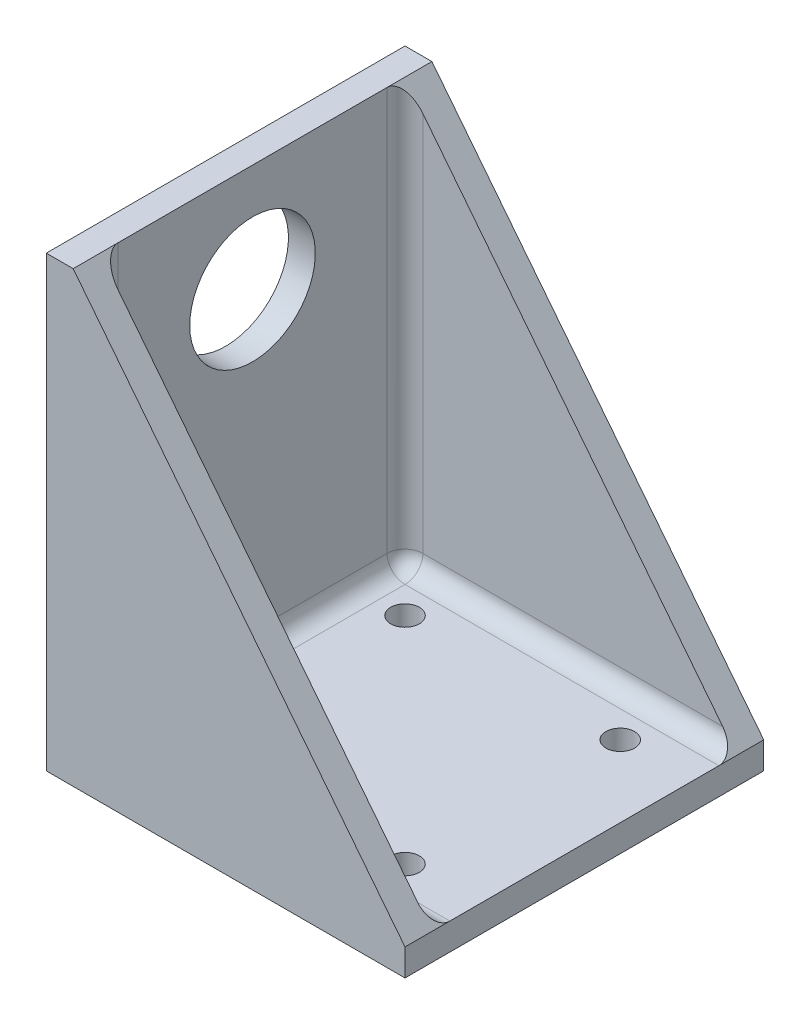
ISO-10303-21;
HEADER;
FILE_DESCRIPTION(('STEP AP214'),'2;1');
FILE_NAME('part.step','',(''),(''),'','','');
FILE_SCHEMA(('AUTOMOTIVE_DESIGN { 1 0 10303 214 1 1 1 1 }'));
ENDSEC;
DATA;
#1=APPLICATION_CONTEXT('core data for automotive mechanical design processes');
#2=APPLICATION_PROTOCOL_DEFINITION('international standard','automotive_design',2000,#1);
#3=PRODUCT_CONTEXT('',#1,'mechanical');
#4=PRODUCT('Part','Part','',(#3));
#5=PRODUCT_RELATED_PRODUCT_CATEGORY('part','',(#4));
#6=PRODUCT_DEFINITION_FORMATION('','',#4);
#7=PRODUCT_DEFINITION_CONTEXT('part definition',#1,'design');
#8=PRODUCT_DEFINITION('design','',#6,#7);
#9=PRODUCT_DEFINITION_SHAPE('','',#8);
#10=(LENGTH_UNIT() NAMED_UNIT(*) SI_UNIT(.MILLI.,.METRE.));
#11=(NAMED_UNIT(*) PLANE_ANGLE_UNIT() SI_UNIT($,.RADIAN.));
#12=(NAMED_UNIT(*) SI_UNIT($,.STERADIAN.) SOLID_ANGLE_UNIT());
#13=UNCERTAINTY_MEASURE_WITH_UNIT(LENGTH_MEASURE(1.E-05),#10,'distance_accuracy_value','');
#14=(GEOMETRIC_REPRESENTATION_CONTEXT(3) GLOBAL_UNCERTAINTY_ASSIGNED_CONTEXT((#13)) GLOBAL_UNIT_ASSIGNED_CONTEXT((#10,
#11,#12)) REPRESENTATION_CONTEXT('',''));
#15=CARTESIAN_POINT('',(0.,0.,0.));
#16=DIRECTION('',(0.,0.,1.));
#17=DIRECTION('',(1.,0.,0.));
#18=AXIS2_PLACEMENT_3D('',#15,#16,#17);
#19=CARTESIAN_POINT('',(0.,3.,0.));
#20=DIRECTION('',(0.,-1.,0.));
#21=DIRECTION('',(0.,0.,-1.));
#22=AXIS2_PLACEMENT_3D('',#19,#20,#21);
#23=PLANE('',#22);
#24=DIRECTION('',(0.,0.,1.));
#25=VECTOR('',#24,1.);
#26=CARTESIAN_POINT('',(-15.,3.,0.));
#27=LINE('',#26,#25);
#28=CARTESIAN_POINT('',(-15.,3.,-15.));
#29=VERTEX_POINT('',#28);
#30=CARTESIAN_POINT('',(-15.,3.,15.));
#31=VERTEX_POINT('',#30);
#32=EDGE_CURVE('E204',#29,#31,#27,.T.);
#33=ORIENTED_EDGE('',*,*,#32,.T.);
#34=DIRECTION('',(1.,0.,0.));
#35=VECTOR('',#34,1.);
#36=CARTESIAN_POINT('',(0.,3.,15.));
#37=LINE('',#36,#35);
#38=CARTESIAN_POINT('',(20.,3.,15.));
#39=VERTEX_POINT('',#38);
#40=EDGE_CURVE('E210',#31,#39,#37,.T.);
#41=ORIENTED_EDGE('',*,*,#40,.T.);
#42=DIRECTION('',(0.,0.,-1.));
#43=VECTOR('',#42,1.);
#44=CARTESIAN_POINT('',(20.,3.,20.));
#45=LINE('',#44,#43);
#46=CARTESIAN_POINT('',(20.,3.,-15.));
#47=VERTEX_POINT('',#46);
#48=EDGE_CURVE('E329',#39,#47,#45,.T.);
#49=ORIENTED_EDGE('',*,*,#48,.T.);
#50=DIRECTION('',(-1.,0.,0.));
#51=VECTOR('',#50,1.);
#52=CARTESIAN_POINT('',(0.,3.,-15.));
#53=LINE('',#52,#51);
#54=EDGE_CURVE('E207',#47,#29,#53,.T.);
#55=ORIENTED_EDGE('',*,*,#54,.T.);
#56=EDGE_LOOP('',(#33,#41,#49,#55));
#57=FACE_BOUND('',#56,.T.);
#58=CARTESIAN_POINT('',(-12.,3.,-12.));
#59=DIRECTION('',(0.,1.,0.));
#60=DIRECTION('',(0.,0.,1.));
#61=AXIS2_PLACEMENT_3D('',#58,#59,#60);
#62=CIRCLE('',#61,1.6);
#63=CARTESIAN_POINT('',(-12.,3.,-10.4));
#64=VERTEX_POINT('',#63);
#65=EDGE_CURVE('E319',#64,#64,#62,.T.);
#66=ORIENTED_EDGE('',*,*,#65,.F.);
#67=EDGE_LOOP('',(#66));
#68=FACE_BOUND('',#67,.T.);
#69=CARTESIAN_POINT('',(-12.,3.,12.));
#70=DIRECTION('',(0.,1.,0.));
#71=DIRECTION('',(0.,0.,-1.));
#72=AXIS2_PLACEMENT_3D('',#69,#70,#71);
#73=CIRCLE('',#72,1.6);
#74=CARTESIAN_POINT('',(-12.,3.,10.4));
#75=VERTEX_POINT('',#74);
#76=EDGE_CURVE('E311',#75,#75,#73,.T.);
#77=ORIENTED_EDGE('',*,*,#76,.F.);
#78=EDGE_LOOP('',(#77));
#79=FACE_BOUND('',#78,.T.);
#80=CARTESIAN_POINT('',(12.,3.,12.));
#81=DIRECTION('',(0.,1.,0.));
#82=DIRECTION('',(0.,0.,1.));
#83=AXIS2_PLACEMENT_3D('',#80,#81,#82);
#84=CIRCLE('',#83,1.6);
#85=CARTESIAN_POINT('',(12.,3.,13.6));
#86=VERTEX_POINT('',#85);
#87=EDGE_CURVE('E303',#86,#86,#84,.T.);
#88=ORIENTED_EDGE('',*,*,#87,.F.);
#89=EDGE_LOOP('',(#88));
#90=FACE_BOUND('',#89,.T.);
#91=CARTESIAN_POINT('',(12.,3.,-12.));
#92=DIRECTION('',(0.,1.,0.));
#93=DIRECTION('',(0.,0.,-1.));
#94=AXIS2_PLACEMENT_3D('',#91,#92,#93);
#95=CIRCLE('',#94,1.6);
#96=CARTESIAN_POINT('',(12.,3.,-13.6));
#97=VERTEX_POINT('',#96);
#98=EDGE_CURVE('E295',#97,#97,#95,.T.);
#99=ORIENTED_EDGE('',*,*,#98,.F.);
#100=EDGE_LOOP('',(#99));
#101=FACE_BOUND('',#100,.T.);
#102=ADVANCED_FACE('F45',(#57,#68,#79,#90,#101),#23,.F.);
#103=CARTESIAN_POINT('',(0.,0.,0.));
#104=DIRECTION('',(0.,-1.,0.));
#105=DIRECTION('',(0.,0.,-1.));
#106=AXIS2_PLACEMENT_3D('',#103,#104,#105);
#107=PLANE('',#106);
#108=DIRECTION('',(1.,0.,0.));
#109=VECTOR('',#108,1.);
#110=CARTESIAN_POINT('',(-20.,0.,20.));
#111=LINE('',#110,#109);
#112=CARTESIAN_POINT('',(-20.,0.,20.));
#113=VERTEX_POINT('',#112);
#114=CARTESIAN_POINT('',(20.,0.,20.));
#115=VERTEX_POINT('',#114);
#116=EDGE_CURVE('E338',#113,#115,#111,.T.);
#117=ORIENTED_EDGE('',*,*,#116,.F.);
#118=DIRECTION('',(0.,0.,1.));
#119=VECTOR('',#118,1.);
#120=CARTESIAN_POINT('',(-20.,0.,20.));
#121=LINE('',#120,#119);
#122=CARTESIAN_POINT('',(-20.,0.,-20.));
#123=VERTEX_POINT('',#122);
#124=EDGE_CURVE('E335',#123,#113,#121,.T.);
#125=ORIENTED_EDGE('',*,*,#124,.F.);
#126=DIRECTION('',(-1.,0.,0.));
#127=VECTOR('',#126,1.);
#128=CARTESIAN_POINT('',(-20.,0.,-20.));
#129=LINE('',#128,#127);
#130=CARTESIAN_POINT('',(20.,0.,-20.));
#131=VERTEX_POINT('',#130);
#132=EDGE_CURVE('E332',#131,#123,#129,.T.);
#133=ORIENTED_EDGE('',*,*,#132,.F.);
#134=DIRECTION('',(0.,0.,-1.));
#135=VECTOR('',#134,1.);
#136=CARTESIAN_POINT('',(20.,0.,20.));
#137=LINE('',#136,#135);
#138=EDGE_CURVE('E171',#115,#131,#137,.T.);
#139=ORIENTED_EDGE('',*,*,#138,.F.);
#140=EDGE_LOOP('',(#117,#125,#133,#139));
#141=FACE_BOUND('',#140,.T.);
#142=CARTESIAN_POINT('',(12.,0.,12.));
#143=DIRECTION('',(0.,1.,0.));
#144=DIRECTION('',(0.,0.,1.));
#145=AXIS2_PLACEMENT_3D('',#142,#143,#144);
#146=CIRCLE('',#145,1.6);
#147=CARTESIAN_POINT('',(12.,0.,13.6));
#148=VERTEX_POINT('',#147);
#149=EDGE_CURVE('E299',#148,#148,#146,.T.);
#150=ORIENTED_EDGE('',*,*,#149,.T.);
#151=EDGE_LOOP('',(#150));
#152=FACE_BOUND('',#151,.T.);
#153=CARTESIAN_POINT('',(-12.,0.,-12.));
#154=DIRECTION('',(0.,1.,0.));
#155=DIRECTION('',(0.,0.,1.));
#156=AXIS2_PLACEMENT_3D('',#153,#154,#155);
#157=CIRCLE('',#156,1.6);
#158=CARTESIAN_POINT('',(-12.,0.,-10.4));
#159=VERTEX_POINT('',#158);
#160=EDGE_CURVE('E315',#159,#159,#157,.T.);
#161=ORIENTED_EDGE('',*,*,#160,.T.);
#162=EDGE_LOOP('',(#161));
#163=FACE_BOUND('',#162,.T.);
#164=CARTESIAN_POINT('',(-12.,0.,12.));
#165=DIRECTION('',(0.,1.,0.));
#166=DIRECTION('',(0.,0.,-1.));
#167=AXIS2_PLACEMENT_3D('',#164,#165,#166);
#168=CIRCLE('',#167,1.6);
#169=CARTESIAN_POINT('',(-12.,0.,10.4));
#170=VERTEX_POINT('',#169);
#171=EDGE_CURVE('E307',#170,#170,#168,.T.);
#172=ORIENTED_EDGE('',*,*,#171,.T.);
#173=EDGE_LOOP('',(#172));
#174=FACE_BOUND('',#173,.T.);
#175=CARTESIAN_POINT('',(12.,0.,-12.));
#176=DIRECTION('',(0.,1.,0.));
#177=DIRECTION('',(0.,0.,-1.));
#178=AXIS2_PLACEMENT_3D('',#175,#176,#177);
#179=CIRCLE('',#178,1.6);
#180=CARTESIAN_POINT('',(12.,0.,-13.6));
#181=VERTEX_POINT('',#180);
#182=EDGE_CURVE('E291',#181,#181,#179,.T.);
#183=ORIENTED_EDGE('',*,*,#182,.T.);
#184=EDGE_LOOP('',(#183));
#185=FACE_BOUND('',#184,.T.);
#186=ADVANCED_FACE('F352',(#141,#152,#163,#174,#185),#107,.T.);
#187=CARTESIAN_POINT('',(20.,3.,20.));
#188=DIRECTION('',(-1.,0.,0.));
#189=DIRECTION('',(0.,0.,1.));
#190=AXIS2_PLACEMENT_3D('',#187,#188,#189);
#191=PLANE('',#190);
#192=ORIENTED_EDGE('',*,*,#138,.T.);
#193=DIRECTION('',(0.,-1.,0.));
#194=VECTOR('',#193,1.);
#195=CARTESIAN_POINT('',(20.,3.,-20.));
#196=LINE('',#195,#194);
#197=CARTESIAN_POINT('',(20.,3.,-20.));
#198=VERTEX_POINT('',#197);
#199=EDGE_CURVE('E161',#198,#131,#196,.T.);
#200=ORIENTED_EDGE('',*,*,#199,.F.);
#201=DIRECTION('',(0.,0.,-1.));
#202=VECTOR('',#201,1.);
#203=CARTESIAN_POINT('',(20.,3.,-17.));
#204=LINE('',#203,#202);
#205=EDGE_CURVE('E63',#47,#198,#204,.T.);
#206=ORIENTED_EDGE('',*,*,#205,.F.);
#207=ORIENTED_EDGE('',*,*,#48,.F.);
#208=CARTESIAN_POINT('',(20.,3.,20.));
#209=VERTEX_POINT('',#208);
#210=EDGE_CURVE('E86',#209,#39,#45,.T.);
#211=ORIENTED_EDGE('',*,*,#210,.F.);
#212=DIRECTION('',(0.,-1.,0.));
#213=VECTOR('',#212,1.);
#214=CARTESIAN_POINT('',(20.,3.,20.));
#215=LINE('',#214,#213);
#216=EDGE_CURVE('E328',#209,#115,#215,.T.);
#217=ORIENTED_EDGE('',*,*,#216,.T.);
#218=EDGE_LOOP('',(#192,#200,#206,#207,#211,#217));
#219=FACE_BOUND('',#218,.T.);
#220=ADVANCED_FACE('F168',(#219),#191,.F.);
#221=CARTESIAN_POINT('',(-20.,3.,-20.));
#222=DIRECTION('',(0.,0.,1.));
#223=DIRECTION('',(1.,0.,0.));
#224=AXIS2_PLACEMENT_3D('',#221,#222,#223);
#225=PLANE('',#224);
#226=ORIENTED_EDGE('',*,*,#132,.T.);
#227=DIRECTION('',(0.,-1.,0.));
#228=VECTOR('',#227,1.);
#229=CARTESIAN_POINT('',(-20.,3.,-20.));
#230=LINE('',#229,#228);
#231=CARTESIAN_POINT('',(-20.,50.,-20.));
#232=VERTEX_POINT('',#231);
#233=EDGE_CURVE('E175',#232,#123,#230,.T.);
#234=ORIENTED_EDGE('',*,*,#233,.F.);
#235=DIRECTION('',(-1.,0.,0.));
#236=VECTOR('',#235,1.);
#237=CARTESIAN_POINT('',(-17.,50.,-20.));
#238=LINE('',#237,#236);
#239=CARTESIAN_POINT('',(-17.,50.,-20.));
#240=VERTEX_POINT('',#239);
#241=EDGE_CURVE('E164',#240,#232,#238,.T.);
#242=ORIENTED_EDGE('',*,*,#241,.F.);
#243=DIRECTION('',(-0.618559606331261,0.785737878312682,0.));
#244=VECTOR('',#243,1.);
#245=CARTESIAN_POINT('',(-17.,50.,-20.));
#246=LINE('',#245,#244);
#247=EDGE_CURVE('E148',#198,#240,#246,.T.);
#248=ORIENTED_EDGE('',*,*,#247,.F.);
#249=ORIENTED_EDGE('',*,*,#199,.T.);
#250=EDGE_LOOP('',(#226,#234,#242,#248,#249));
#251=FACE_BOUND('',#250,.T.);
#252=ADVANCED_FACE('F160',(#251),#225,.F.);
#253=CARTESIAN_POINT('',(-20.,3.,20.));
#254=DIRECTION('',(1.,0.,0.));
#255=DIRECTION('',(0.,0.,-1.));
#256=AXIS2_PLACEMENT_3D('',#253,#254,#255);
#257=PLANE('',#256);
#258=DIRECTION('',(0.,0.,-1.));
#259=VECTOR('',#258,1.);
#260=CARTESIAN_POINT('',(-20.,50.,-20.));
#261=LINE('',#260,#259);
#262=CARTESIAN_POINT('',(-20.,50.,20.));
#263=VERTEX_POINT('',#262);
#264=EDGE_CURVE('E282',#263,#232,#261,.T.);
#265=ORIENTED_EDGE('',*,*,#264,.T.);
#266=ORIENTED_EDGE('',*,*,#233,.T.);
#267=ORIENTED_EDGE('',*,*,#124,.T.);
#268=DIRECTION('',(0.,-1.,0.));
#269=VECTOR('',#268,1.);
#270=CARTESIAN_POINT('',(-20.,3.,20.));
#271=LINE('',#270,#269);
#272=EDGE_CURVE('E182',#263,#113,#271,.T.);
#273=ORIENTED_EDGE('',*,*,#272,.F.);
#274=EDGE_LOOP('',(#265,#266,#267,#273));
#275=FACE_BOUND('',#274,.T.);
#276=CARTESIAN_POINT('',(-20.,38.,0.));
#277=DIRECTION('',(-1.,0.,0.));
#278=DIRECTION('',(0.,0.,1.));
#279=AXIS2_PLACEMENT_3D('',#276,#277,#278);
#280=CIRCLE('',#279,7.);
#281=CARTESIAN_POINT('',(-20.,38.,7.00000000000002));
#282=VERTEX_POINT('',#281);
#283=EDGE_CURVE('E269',#282,#282,#280,.T.);
#284=ORIENTED_EDGE('',*,*,#283,.F.);
#285=EDGE_LOOP('',(#284));
#286=FACE_BOUND('',#285,.T.);
#287=ADVANCED_FACE('F354',(#275,#286),#257,.F.);
#288=CARTESIAN_POINT('',(-20.,3.,20.));
#289=DIRECTION('',(0.,0.,-1.));
#290=DIRECTION('',(-1.,0.,0.));
#291=AXIS2_PLACEMENT_3D('',#288,#289,#290);
#292=PLANE('',#291);
#293=ORIENTED_EDGE('',*,*,#216,.F.);
#294=DIRECTION('',(-0.618559606331261,0.785737878312682,0.));
#295=VECTOR('',#294,1.);
#296=CARTESIAN_POINT('',(-17.,50.,20.));
#297=LINE('',#296,#295);
#298=CARTESIAN_POINT('',(-17.,50.,20.));
#299=VERTEX_POINT('',#298);
#300=EDGE_CURVE('E154',#209,#299,#297,.T.);
#301=ORIENTED_EDGE('',*,*,#300,.T.);
#302=DIRECTION('',(-1.,0.,0.));
#303=VECTOR('',#302,1.);
#304=CARTESIAN_POINT('',(-17.,50.,20.));
#305=LINE('',#304,#303);
#306=EDGE_CURVE('E286',#299,#263,#305,.T.);
#307=ORIENTED_EDGE('',*,*,#306,.T.);
#308=ORIENTED_EDGE('',*,*,#272,.T.);
#309=ORIENTED_EDGE('',*,*,#116,.T.);
#310=EDGE_LOOP('',(#293,#301,#307,#308,#309));
#311=FACE_BOUND('',#310,.T.);
#312=ADVANCED_FACE('F347',(#311),#292,.F.);
#313=CARTESIAN_POINT('',(-12.,3.,-12.));
#314=DIRECTION('',(0.,-1.,0.));
#315=DIRECTION('',(0.,0.,-1.));
#316=AXIS2_PLACEMENT_3D('',#313,#314,#315);
#317=CYLINDRICAL_SURFACE('',#316,1.6);
#318=ORIENTED_EDGE('',*,*,#65,.T.);
#319=EDGE_LOOP('',(#318));
#320=FACE_BOUND('',#319,.T.);
#321=ORIENTED_EDGE('',*,*,#160,.F.);
#322=EDGE_LOOP('',(#321));
#323=FACE_BOUND('',#322,.T.);
#324=ADVANCED_FACE('F392',(#320,#323),#317,.F.);
#325=CARTESIAN_POINT('',(-12.,3.,12.));
#326=DIRECTION('',(0.,-1.,0.));
#327=DIRECTION('',(0.,0.,-1.));
#328=AXIS2_PLACEMENT_3D('',#325,#326,#327);
#329=CYLINDRICAL_SURFACE('',#328,1.6);
#330=ORIENTED_EDGE('',*,*,#76,.T.);
#331=EDGE_LOOP('',(#330));
#332=FACE_BOUND('',#331,.T.);
#333=ORIENTED_EDGE('',*,*,#171,.F.);
#334=EDGE_LOOP('',(#333));
#335=FACE_BOUND('',#334,.T.);
#336=ADVANCED_FACE('F518',(#332,#335),#329,.F.);
#337=CARTESIAN_POINT('',(12.,3.,12.));
#338=DIRECTION('',(0.,-1.,0.));
#339=DIRECTION('',(0.,0.,-1.));
#340=AXIS2_PLACEMENT_3D('',#337,#338,#339);
#341=CYLINDRICAL_SURFACE('',#340,1.6);
#342=ORIENTED_EDGE('',*,*,#87,.T.);
#343=EDGE_LOOP('',(#342));
#344=FACE_BOUND('',#343,.T.);
#345=ORIENTED_EDGE('',*,*,#149,.F.);
#346=EDGE_LOOP('',(#345));
#347=FACE_BOUND('',#346,.T.);
#348=ADVANCED_FACE('F508',(#344,#347),#341,.F.);
#349=CARTESIAN_POINT('',(12.,3.,-12.));
#350=DIRECTION('',(0.,-1.,0.));
#351=DIRECTION('',(0.,0.,-1.));
#352=AXIS2_PLACEMENT_3D('',#349,#350,#351);
#353=CYLINDRICAL_SURFACE('',#352,1.6);
#354=ORIENTED_EDGE('',*,*,#98,.T.);
#355=EDGE_LOOP('',(#354));
#356=FACE_BOUND('',#355,.T.);
#357=ORIENTED_EDGE('',*,*,#182,.F.);
#358=EDGE_LOOP('',(#357));
#359=FACE_BOUND('',#358,.T.);
#360=ADVANCED_FACE('F499',(#356,#359),#353,.F.);
#361=CARTESIAN_POINT('',(-17.,0.,0.));
#362=DIRECTION('',(1.,0.,0.));
#363=DIRECTION('',(0.,0.,-1.));
#364=AXIS2_PLACEMENT_3D('',#361,#362,#363);
#365=PLANE('',#364);
#366=DIRECTION('',(0.,0.,1.));
#367=VECTOR('',#366,1.);
#368=CARTESIAN_POINT('',(-17.,5.,0.));
#369=LINE('',#368,#367);
#370=CARTESIAN_POINT('',(-17.,5.,15.));
#371=VERTEX_POINT('',#370);
#372=CARTESIAN_POINT('',(-17.,5.,-15.));
#373=VERTEX_POINT('',#372);
#374=EDGE_CURVE('E189',#371,#373,#369,.F.);
#375=ORIENTED_EDGE('',*,*,#374,.T.);
#376=DIRECTION('',(0.,-1.,0.));
#377=VECTOR('',#376,1.);
#378=CARTESIAN_POINT('',(-17.,50.,-15.));
#379=LINE('',#378,#377);
#380=CARTESIAN_POINT('',(-17.,50.,-15.));
#381=VERTEX_POINT('',#380);
#382=EDGE_CURVE('E195',#373,#381,#379,.F.);
#383=ORIENTED_EDGE('',*,*,#382,.T.);
#384=DIRECTION('',(0.,0.,-1.));
#385=VECTOR('',#384,1.);
#386=CARTESIAN_POINT('',(-17.,50.,-20.));
#387=LINE('',#386,#385);
#388=CARTESIAN_POINT('',(-17.,50.,15.));
#389=VERTEX_POINT('',#388);
#390=EDGE_CURVE('E259',#389,#381,#387,.T.);
#391=ORIENTED_EDGE('',*,*,#390,.F.);
#392=DIRECTION('',(0.,1.,0.));
#393=VECTOR('',#392,1.);
#394=CARTESIAN_POINT('',(-17.,3.,15.));
#395=LINE('',#394,#393);
#396=EDGE_CURVE('E192',#389,#371,#395,.F.);
#397=ORIENTED_EDGE('',*,*,#396,.T.);
#398=EDGE_LOOP('',(#375,#383,#391,#397));
#399=FACE_BOUND('',#398,.T.);
#400=CARTESIAN_POINT('',(-17.,38.,0.));
#401=DIRECTION('',(-1.,0.,0.));
#402=DIRECTION('',(0.,0.,1.));
#403=AXIS2_PLACEMENT_3D('',#400,#401,#402);
#404=CIRCLE('',#403,7.);
#405=CARTESIAN_POINT('',(-17.,38.,7.00000000000002));
#406=VERTEX_POINT('',#405);
#407=EDGE_CURVE('E274',#406,#406,#404,.T.);
#408=ORIENTED_EDGE('',*,*,#407,.T.);
#409=EDGE_LOOP('',(#408));
#410=FACE_BOUND('',#409,.T.);
#411=ADVANCED_FACE('F256',(#399,#410),#365,.T.);
#412=CARTESIAN_POINT('',(-17.,50.,-20.));
#413=DIRECTION('',(0.,1.,0.));
#414=DIRECTION('',(0.,0.,1.));
#415=AXIS2_PLACEMENT_3D('',#412,#413,#414);
#416=PLANE('',#415);
#417=EDGE_CURVE('E72',#299,#389,#387,.T.);
#418=ORIENTED_EDGE('',*,*,#417,.T.);
#419=ORIENTED_EDGE('',*,*,#390,.T.);
#420=DIRECTION('',(0.,0.,-1.));
#421=VECTOR('',#420,1.);
#422=CARTESIAN_POINT('',(-17.,50.,-17.));
#423=LINE('',#422,#421);
#424=EDGE_CURVE('E155',#381,#240,#423,.T.);
#425=ORIENTED_EDGE('',*,*,#424,.T.);
#426=ORIENTED_EDGE('',*,*,#241,.T.);
#427=ORIENTED_EDGE('',*,*,#264,.F.);
#428=ORIENTED_EDGE('',*,*,#306,.F.);
#429=EDGE_LOOP('',(#418,#419,#425,#426,#427,#428));
#430=FACE_BOUND('',#429,.T.);
#431=ADVANCED_FACE('F356',(#430),#416,.T.);
#432=CARTESIAN_POINT('',(-17.,38.,0.));
#433=DIRECTION('',(-1.,0.,0.));
#434=DIRECTION('',(0.,0.,1.));
#435=AXIS2_PLACEMENT_3D('',#432,#433,#434);
#436=CYLINDRICAL_SURFACE('',#435,7.);
#437=ORIENTED_EDGE('',*,*,#407,.F.);
#438=EDGE_LOOP('',(#437));
#439=FACE_BOUND('',#438,.T.);
#440=ORIENTED_EDGE('',*,*,#283,.T.);
#441=EDGE_LOOP('',(#440));
#442=FACE_BOUND('',#441,.T.);
#443=ADVANCED_FACE('F475',(#439,#442),#436,.F.);
#444=CARTESIAN_POINT('',(0.,0.,17.));
#445=DIRECTION('',(0.,0.,-1.));
#446=DIRECTION('',(-1.,0.,0.));
#447=AXIS2_PLACEMENT_3D('',#444,#445,#446);
#448=PLANE('',#447);
#449=DIRECTION('',(1.,0.,0.));
#450=VECTOR('',#449,1.);
#451=CARTESIAN_POINT('',(0.,5.,17.));
#452=LINE('',#451,#450);
#453=CARTESIAN_POINT('',(18.4255319148936,5.,17.));
#454=VERTEX_POINT('',#453);
#455=CARTESIAN_POINT('',(-15.,5.,17.));
#456=VERTEX_POINT('',#455);
#457=EDGE_CURVE('E97',#454,#456,#452,.F.);
#458=ORIENTED_EDGE('',*,*,#457,.T.);
#459=DIRECTION('',(0.,1.,0.));
#460=VECTOR('',#459,1.);
#461=CARTESIAN_POINT('',(-15.,50.,17.));
#462=LINE('',#461,#460);
#463=CARTESIAN_POINT('',(-15.,47.4594594594595,17.));
#464=VERTEX_POINT('',#463);
#465=EDGE_CURVE('E201',#456,#464,#462,.T.);
#466=ORIENTED_EDGE('',*,*,#465,.T.);
#467=DIRECTION('',(-0.618559606331261,0.785737878312682,0.));
#468=VECTOR('',#467,1.);
#469=CARTESIAN_POINT('',(-17.,50.,17.));
#470=LINE('',#469,#468);
#471=EDGE_CURVE('E265',#454,#464,#470,.T.);
#472=ORIENTED_EDGE('',*,*,#471,.F.);
#473=EDGE_LOOP('',(#458,#466,#472));
#474=FACE_BOUND('',#473,.T.);
#475=ADVANCED_FACE('F264',(#474),#448,.T.);
#476=CARTESIAN_POINT('',(-17.,50.,17.));
#477=DIRECTION('',(0.785737878312682,0.618559606331261,0.));
#478=DIRECTION('',(-0.618559606331261,0.785737878312682,0.));
#479=AXIS2_PLACEMENT_3D('',#476,#477,#478);
#480=PLANE('',#479);
#481=ORIENTED_EDGE('',*,*,#300,.F.);
#482=ORIENTED_EDGE('',*,*,#210,.T.);
#483=CARTESIAN_POINT('',(18.4255319148936,5.,15.));
#484=DIRECTION('',(0.785737878312682,0.618559606331261,0.));
#485=DIRECTION('',(0.618559606331261,-0.785737878312682,0.));
#486=AXIS2_PLACEMENT_3D('',#483,#484,#485);
#487=ELLIPSE('',#486,2.5453781155299,2.);
#488=EDGE_CURVE('E55',#39,#454,#487,.F.);
#489=ORIENTED_EDGE('',*,*,#488,.T.);
#490=ORIENTED_EDGE('',*,*,#471,.T.);
#491=CARTESIAN_POINT('',(-15.,47.4594594594595,15.));
#492=DIRECTION('',(0.785737878312682,0.618559606331261,0.));
#493=DIRECTION('',(0.618559606331261,-0.785737878312682,0.));
#494=AXIS2_PLACEMENT_3D('',#491,#492,#493);
#495=ELLIPSE('',#494,3.2333181467542,2.);
#496=EDGE_CURVE('E216',#464,#389,#495,.F.);
#497=ORIENTED_EDGE('',*,*,#496,.T.);
#498=ORIENTED_EDGE('',*,*,#417,.F.);
#499=EDGE_LOOP('',(#481,#482,#489,#490,#497,#498));
#500=FACE_BOUND('',#499,.T.);
#501=ADVANCED_FACE('F266',(#500),#480,.T.);
#502=CARTESIAN_POINT('',(0.,0.,-17.));
#503=DIRECTION('',(0.,0.,1.));
#504=DIRECTION('',(-1.,0.,0.));
#505=AXIS2_PLACEMENT_3D('',#502,#503,#504);
#506=PLANE('',#505);
#507=DIRECTION('',(-0.618559606331261,0.785737878312682,0.));
#508=VECTOR('',#507,1.);
#509=CARTESIAN_POINT('',(-17.,50.,-17.));
#510=LINE('',#509,#508);
#511=CARTESIAN_POINT('',(18.4255319148936,5.,-17.));
#512=VERTEX_POINT('',#511);
#513=CARTESIAN_POINT('',(-15.,47.4594594594595,-17.));
#514=VERTEX_POINT('',#513);
#515=EDGE_CURVE('E166',#512,#514,#510,.T.);
#516=ORIENTED_EDGE('',*,*,#515,.T.);
#517=DIRECTION('',(0.,-1.,0.));
#518=VECTOR('',#517,1.);
#519=CARTESIAN_POINT('',(-15.,3.,-17.));
#520=LINE('',#519,#518);
#521=CARTESIAN_POINT('',(-15.,5.,-17.));
#522=VERTEX_POINT('',#521);
#523=EDGE_CURVE('E179',#514,#522,#520,.T.);
#524=ORIENTED_EDGE('',*,*,#523,.T.);
#525=DIRECTION('',(-1.,0.,0.));
#526=VECTOR('',#525,1.);
#527=CARTESIAN_POINT('',(0.,5.,-17.));
#528=LINE('',#527,#526);
#529=EDGE_CURVE('E174',#522,#512,#528,.F.);
#530=ORIENTED_EDGE('',*,*,#529,.T.);
#531=EDGE_LOOP('',(#516,#524,#530));
#532=FACE_BOUND('',#531,.T.);
#533=ADVANCED_FACE('F364',(#532),#506,.T.);
#534=CARTESIAN_POINT('',(-17.,50.,-17.));
#535=DIRECTION('',(-0.785737878312682,-0.618559606331261,0.));
#536=DIRECTION('',(0.618559606331261,-0.785737878312682,0.));
#537=AXIS2_PLACEMENT_3D('',#534,#535,#536);
#538=PLANE('',#537);
#539=ORIENTED_EDGE('',*,*,#247,.T.);
#540=ORIENTED_EDGE('',*,*,#424,.F.);
#541=CARTESIAN_POINT('',(-15.,47.4594594594595,-15.));
#542=DIRECTION('',(-0.785737878312682,-0.618559606331261,0.));
#543=DIRECTION('',(-0.618559606331261,0.785737878312682,0.));
#544=AXIS2_PLACEMENT_3D('',#541,#542,#543);
#545=ELLIPSE('',#544,3.2333181467542,2.);
#546=EDGE_CURVE('E213',#381,#514,#545,.T.);
#547=ORIENTED_EDGE('',*,*,#546,.T.);
#548=ORIENTED_EDGE('',*,*,#515,.F.);
#549=CARTESIAN_POINT('',(18.4255319148936,5.,-15.));
#550=DIRECTION('',(-0.785737878312682,-0.618559606331261,0.));
#551=DIRECTION('',(-0.618559606331261,0.785737878312682,0.));
#552=AXIS2_PLACEMENT_3D('',#549,#550,#551);
#553=ELLIPSE('',#552,2.5453781155299,2.);
#554=EDGE_CURVE('E11',#512,#47,#553,.T.);
#555=ORIENTED_EDGE('',*,*,#554,.T.);
#556=ORIENTED_EDGE('',*,*,#205,.T.);
#557=EDGE_LOOP('',(#539,#540,#547,#548,#555,#556));
#558=FACE_BOUND('',#557,.T.);
#559=ADVANCED_FACE('F146',(#558),#538,.F.);
#560=CARTESIAN_POINT('',(0.,5.,15.));
#561=DIRECTION('',(1.,0.,0.));
#562=DIRECTION('',(0.,0.,-1.));
#563=AXIS2_PLACEMENT_3D('',#560,#561,#562);
#564=CYLINDRICAL_SURFACE('',#563,2.);
#565=ORIENTED_EDGE('',*,*,#488,.F.);
#566=ORIENTED_EDGE('',*,*,#40,.F.);
#567=CARTESIAN_POINT('',(-15.,5.,15.));
#568=DIRECTION('',(1.,0.,0.));
#569=DIRECTION('',(0.,0.,-1.));
#570=AXIS2_PLACEMENT_3D('',#567,#568,#569);
#571=CIRCLE('',#570,2.);
#572=EDGE_CURVE('E49',#456,#31,#571,.T.);
#573=ORIENTED_EDGE('',*,*,#572,.F.);
#574=ORIENTED_EDGE('',*,*,#457,.F.);
#575=EDGE_LOOP('',(#565,#566,#573,#574));
#576=FACE_BOUND('',#575,.T.);
#577=ADVANCED_FACE('F47',(#576),#564,.F.);
#578=CARTESIAN_POINT('',(-15.,0.,15.));
#579=DIRECTION('',(0.,-1.,0.));
#580=DIRECTION('',(1.,0.,0.));
#581=AXIS2_PLACEMENT_3D('',#578,#579,#580);
#582=CYLINDRICAL_SURFACE('',#581,2.);
#583=ORIENTED_EDGE('',*,*,#496,.F.);
#584=ORIENTED_EDGE('',*,*,#465,.F.);
#585=CARTESIAN_POINT('',(-15.,5.,15.));
#586=DIRECTION('',(0.,1.,0.));
#587=DIRECTION('',(0.,0.,1.));
#588=AXIS2_PLACEMENT_3D('',#585,#586,#587);
#589=CIRCLE('',#588,2.);
#590=EDGE_CURVE('E236',#371,#456,#589,.T.);
#591=ORIENTED_EDGE('',*,*,#590,.F.);
#592=ORIENTED_EDGE('',*,*,#396,.F.);
#593=EDGE_LOOP('',(#583,#584,#591,#592));
#594=FACE_BOUND('',#593,.T.);
#595=ADVANCED_FACE('F262',(#594),#582,.F.);
#596=CARTESIAN_POINT('',(-15.,5.,15.));
#597=DIRECTION('',(0.,0.,1.));
#598=DIRECTION('',(1.,0.,0.));
#599=AXIS2_PLACEMENT_3D('',#596,#597,#598);
#600=SPHERICAL_SURFACE('',#599,2.);
#601=ORIENTED_EDGE('',*,*,#590,.T.);
#602=ORIENTED_EDGE('',*,*,#572,.T.);
#603=CARTESIAN_POINT('',(-15.,5.,15.));
#604=DIRECTION('',(0.,0.,-1.));
#605=DIRECTION('',(-1.,0.,0.));
#606=AXIS2_PLACEMENT_3D('',#603,#604,#605);
#607=CIRCLE('',#606,2.);
#608=EDGE_CURVE('E233',#371,#31,#607,.F.);
#609=ORIENTED_EDGE('',*,*,#608,.F.);
#610=EDGE_LOOP('',(#601,#602,#609));
#611=FACE_BOUND('',#610,.T.);
#612=ADVANCED_FACE('F245',(#611),#600,.F.);
#613=CARTESIAN_POINT('',(0.,5.,-15.));
#614=DIRECTION('',(-1.,0.,0.));
#615=DIRECTION('',(0.,0.,1.));
#616=AXIS2_PLACEMENT_3D('',#613,#614,#615);
#617=CYLINDRICAL_SURFACE('',#616,2.);
#618=ORIENTED_EDGE('',*,*,#554,.F.);
#619=ORIENTED_EDGE('',*,*,#529,.F.);
#620=CARTESIAN_POINT('',(-15.,5.,-15.));
#621=DIRECTION('',(1.,0.,0.));
#622=DIRECTION('',(0.,0.,-1.));
#623=AXIS2_PLACEMENT_3D('',#620,#621,#622);
#624=CIRCLE('',#623,2.);
#625=EDGE_CURVE('E229',#29,#522,#624,.T.);
#626=ORIENTED_EDGE('',*,*,#625,.F.);
#627=ORIENTED_EDGE('',*,*,#54,.F.);
#628=EDGE_LOOP('',(#618,#619,#626,#627));
#629=FACE_BOUND('',#628,.T.);
#630=ADVANCED_FACE('F372',(#629),#617,.F.);
#631=CARTESIAN_POINT('',(-15.,5.,0.));
#632=DIRECTION('',(0.,0.,1.));
#633=DIRECTION('',(1.,0.,0.));
#634=AXIS2_PLACEMENT_3D('',#631,#632,#633);
#635=CYLINDRICAL_SURFACE('',#634,2.);
#636=ORIENTED_EDGE('',*,*,#608,.T.);
#637=ORIENTED_EDGE('',*,*,#32,.F.);
#638=CARTESIAN_POINT('',(-15.,5.,-15.));
#639=DIRECTION('',(0.,0.,1.));
#640=DIRECTION('',(1.,0.,0.));
#641=AXIS2_PLACEMENT_3D('',#638,#639,#640);
#642=CIRCLE('',#641,2.);
#643=EDGE_CURVE('E225',#373,#29,#642,.T.);
#644=ORIENTED_EDGE('',*,*,#643,.F.);
#645=ORIENTED_EDGE('',*,*,#374,.F.);
#646=EDGE_LOOP('',(#636,#637,#644,#645));
#647=FACE_BOUND('',#646,.T.);
#648=ADVANCED_FACE('F251',(#647),#635,.F.);
#649=CARTESIAN_POINT('',(-15.,5.,-15.));
#650=DIRECTION('',(0.,-1.,0.));
#651=DIRECTION('',(0.,0.,-1.));
#652=AXIS2_PLACEMENT_3D('',#649,#650,#651);
#653=SPHERICAL_SURFACE('',#652,2.);
#654=ORIENTED_EDGE('',*,*,#643,.T.);
#655=ORIENTED_EDGE('',*,*,#625,.T.);
#656=CARTESIAN_POINT('',(-15.,5.,-15.));
#657=DIRECTION('',(0.,1.,0.));
#658=DIRECTION('',(0.,0.,1.));
#659=AXIS2_PLACEMENT_3D('',#656,#657,#658);
#660=CIRCLE('',#659,2.);
#661=EDGE_CURVE('E222',#373,#522,#660,.F.);
#662=ORIENTED_EDGE('',*,*,#661,.F.);
#663=EDGE_LOOP('',(#654,#655,#662));
#664=FACE_BOUND('',#663,.T.);
#665=ADVANCED_FACE('F370',(#664),#653,.F.);
#666=CARTESIAN_POINT('',(-15.,0.,-15.));
#667=DIRECTION('',(0.,1.,0.));
#668=DIRECTION('',(-1.,0.,0.));
#669=AXIS2_PLACEMENT_3D('',#666,#667,#668);
#670=CYLINDRICAL_SURFACE('',#669,2.);
#671=ORIENTED_EDGE('',*,*,#546,.F.);
#672=ORIENTED_EDGE('',*,*,#382,.F.);
#673=ORIENTED_EDGE('',*,*,#661,.T.);
#674=ORIENTED_EDGE('',*,*,#523,.F.);
#675=EDGE_LOOP('',(#671,#672,#673,#674));
#676=FACE_BOUND('',#675,.T.);
#677=ADVANCED_FACE('F367',(#676),#670,.F.);
#678=CLOSED_SHELL('',(#102,#186,#220,#252,#287,#312,#324,#336,#348,#360,#411,#431,#443,#475,
#501,#533,#559,#577,#595,#612,#630,#648,#665,#677));
#679=MANIFOLD_SOLID_BREP('B2',#678);
#680=ADVANCED_BREP_SHAPE_REPRESENTATION('',(#18,#679),#14);
#681=SHAPE_DEFINITION_REPRESENTATION(#9,#680);
ENDSEC;
END-ISO-10303-21;
